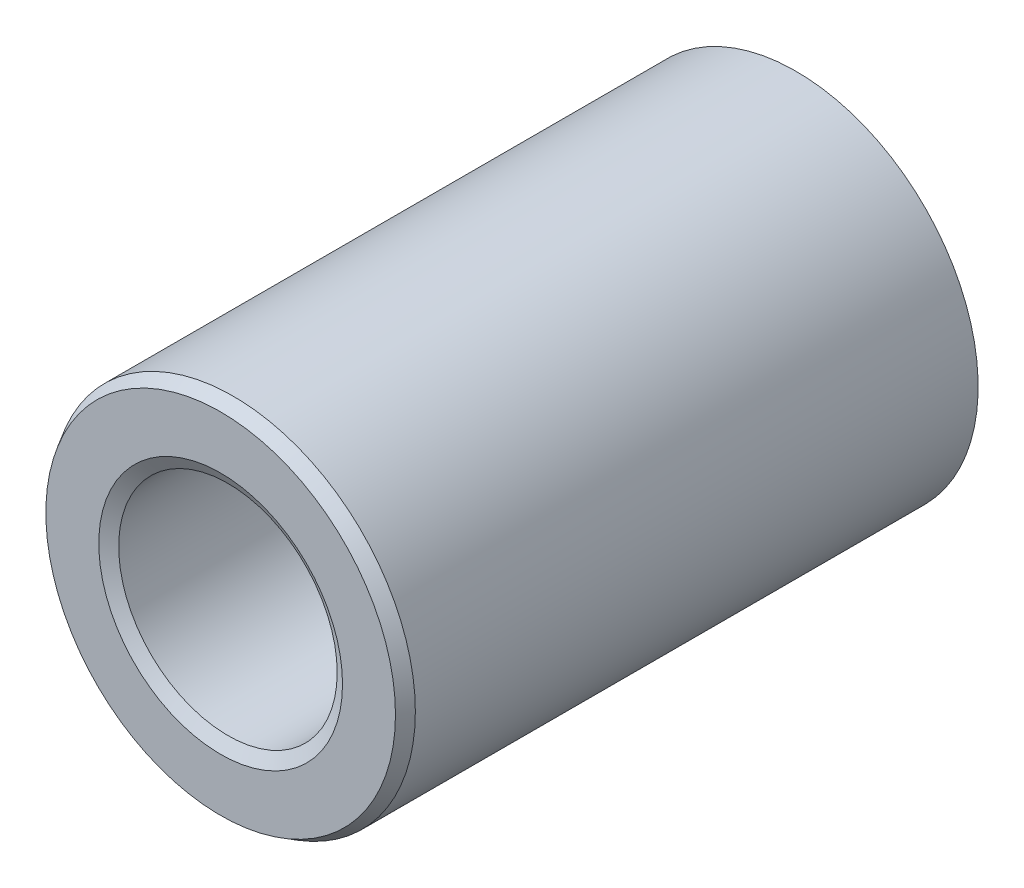
ISO-10303-21;
HEADER;
FILE_DESCRIPTION(('STEP AP214'),'2;1');
FILE_NAME('part.step','',(''),(''),'','','');
FILE_SCHEMA(('AUTOMOTIVE_DESIGN { 1 0 10303 214 1 1 1 1 }'));
ENDSEC;
DATA;
#1=APPLICATION_CONTEXT('core data for automotive mechanical design processes');
#2=APPLICATION_PROTOCOL_DEFINITION('international standard','automotive_design',2000,#1);
#3=PRODUCT_CONTEXT('',#1,'mechanical');
#4=PRODUCT('Part','Part','',(#3));
#5=PRODUCT_RELATED_PRODUCT_CATEGORY('part','',(#4));
#6=PRODUCT_DEFINITION_FORMATION('','',#4);
#7=PRODUCT_DEFINITION_CONTEXT('part definition',#1,'design');
#8=PRODUCT_DEFINITION('design','',#6,#7);
#9=PRODUCT_DEFINITION_SHAPE('','',#8);
#10=(LENGTH_UNIT() NAMED_UNIT(*) SI_UNIT(.MILLI.,.METRE.));
#11=(NAMED_UNIT(*) PLANE_ANGLE_UNIT() SI_UNIT($,.RADIAN.));
#12=(NAMED_UNIT(*) SI_UNIT($,.STERADIAN.) SOLID_ANGLE_UNIT());
#13=UNCERTAINTY_MEASURE_WITH_UNIT(LENGTH_MEASURE(1.E-05),#10,'distance_accuracy_value','');
#14=(GEOMETRIC_REPRESENTATION_CONTEXT(3) GLOBAL_UNCERTAINTY_ASSIGNED_CONTEXT((#13)) GLOBAL_UNIT_ASSIGNED_CONTEXT((#10,
#11,#12)) REPRESENTATION_CONTEXT('',''));
#15=CARTESIAN_POINT('',(0.,0.,0.));
#16=DIRECTION('',(0.,0.,1.));
#17=DIRECTION('',(1.,0.,0.));
#18=AXIS2_PLACEMENT_3D('',#15,#16,#17);
#19=CARTESIAN_POINT('',(0.,0.,-4.));
#20=DIRECTION('',(0.,0.,-1.));
#21=DIRECTION('',(1.,0.,0.));
#22=AXIS2_PLACEMENT_3D('',#19,#20,#21);
#23=PLANE('',#22);
#24=CARTESIAN_POINT('',(0.,0.,-4.));
#25=DIRECTION('',(0.,0.,1.));
#26=DIRECTION('',(1.,0.,0.));
#27=AXIS2_PLACEMENT_3D('',#24,#25,#26);
#28=CIRCLE('',#27,1.6);
#29=CARTESIAN_POINT('',(1.6,0.,-4.));
#30=VERTEX_POINT('',#29);
#31=EDGE_CURVE('E10',#30,#30,#28,.F.);
#32=ORIENTED_EDGE('',*,*,#31,.F.);
#33=EDGE_LOOP('',(#32));
#34=FACE_BOUND('',#33,.T.);
#35=CARTESIAN_POINT('',(0.,0.,-4.));
#36=DIRECTION('',(0.,0.,1.));
#37=DIRECTION('',(1.,0.,0.));
#38=AXIS2_PLACEMENT_3D('',#35,#36,#37);
#39=CIRCLE('',#38,2.32679491924311);
#40=CARTESIAN_POINT('',(-2.32679491924311,0.,-4.));
#41=VERTEX_POINT('',#40);
#42=EDGE_CURVE('E46',#41,#41,#39,.T.);
#43=ORIENTED_EDGE('',*,*,#42,.F.);
#44=EDGE_LOOP('',(#43));
#45=FACE_BOUND('',#44,.T.);
#46=ADVANCED_FACE('F39',(#34,#45),#23,.T.);
#47=CARTESIAN_POINT('',(0.,0.,4.));
#48=DIRECTION('',(0.,0.,-1.));
#49=DIRECTION('',(1.,0.,0.));
#50=AXIS2_PLACEMENT_3D('',#47,#48,#49);
#51=PLANE('',#50);
#52=CARTESIAN_POINT('',(0.,0.,4.));
#53=DIRECTION('',(0.,0.,1.));
#54=DIRECTION('',(1.,0.,0.));
#55=AXIS2_PLACEMENT_3D('',#52,#53,#54);
#56=CIRCLE('',#55,1.67320508075689);
#57=CARTESIAN_POINT('',(1.67320508075689,0.,4.));
#58=VERTEX_POINT('',#57);
#59=EDGE_CURVE('E65',#58,#58,#56,.T.);
#60=ORIENTED_EDGE('',*,*,#59,.F.);
#61=EDGE_LOOP('',(#60));
#62=FACE_BOUND('',#61,.T.);
#63=CARTESIAN_POINT('',(0.,0.,4.));
#64=DIRECTION('',(0.,0.,1.));
#65=DIRECTION('',(1.,0.,0.));
#66=AXIS2_PLACEMENT_3D('',#63,#64,#65);
#67=CIRCLE('',#66,2.4);
#68=CARTESIAN_POINT('',(2.4,0.,4.));
#69=VERTEX_POINT('',#68);
#70=EDGE_CURVE('E66',#69,#69,#67,.F.);
#71=ORIENTED_EDGE('',*,*,#70,.F.);
#72=EDGE_LOOP('',(#71));
#73=FACE_BOUND('',#72,.T.);
#74=ADVANCED_FACE('F75',(#62,#73),#51,.F.);
#75=CARTESIAN_POINT('',(0.,0.,-4.));
#76=DIRECTION('',(0.,0.,1.));
#77=DIRECTION('',(-1.,0.,0.));
#78=AXIS2_PLACEMENT_3D('',#75,#76,#77);
#79=CYLINDRICAL_SURFACE('',#78,2.5);
#80=CARTESIAN_POINT('',(0.,0.,3.82679491924311));
#81=DIRECTION('',(0.,0.,1.));
#82=DIRECTION('',(1.,0.,0.));
#83=AXIS2_PLACEMENT_3D('',#80,#81,#82);
#84=CIRCLE('',#83,2.5);
#85=CARTESIAN_POINT('',(-2.5,0.,3.82679491924311));
#86=VERTEX_POINT('',#85);
#87=EDGE_CURVE('E49',#86,#86,#84,.T.);
#88=CARTESIAN_POINT('',(0.,0.,-3.9));
#89=DIRECTION('',(0.,0.,1.));
#90=DIRECTION('',(1.,0.,0.));
#91=AXIS2_PLACEMENT_3D('',#88,#89,#90);
#92=CIRCLE('',#91,2.5);
#93=CARTESIAN_POINT('',(-2.5,0.,-3.9));
#94=VERTEX_POINT('',#93);
#95=EDGE_CURVE('E53',#94,#94,#92,.F.);
#96=CARTESIAN_POINT('',(-2.5,0.,3.82679491924311));
#97=CARTESIAN_POINT('',(-2.5,0.,3.74630747216766));
#98=CARTESIAN_POINT('',(-2.5,0.,3.66582002509221));
#99=CARTESIAN_POINT('',(-2.5,0.,3.50484513094131));
#100=CARTESIAN_POINT('',(-2.5,0.,3.42435768386586));
#101=CARTESIAN_POINT('',(-2.5,0.,3.26338278971496));
#102=CARTESIAN_POINT('',(-2.5,0.,3.18289534263951));
#103=CARTESIAN_POINT('',(-2.5,0.,3.02192044848862));
#104=CARTESIAN_POINT('',(-2.5,0.,2.94143300141317));
#105=CARTESIAN_POINT('',(-2.5,0.,2.78045810726227));
#106=CARTESIAN_POINT('',(-2.5,0.,2.69997066018682));
#107=CARTESIAN_POINT('',(-2.5,0.,2.53899576603592));
#108=CARTESIAN_POINT('',(-2.5,0.,2.45850831896047));
#109=CARTESIAN_POINT('',(-2.5,0.,2.29753342480958));
#110=CARTESIAN_POINT('',(-2.5,0.,2.21704597773413));
#111=CARTESIAN_POINT('',(-2.5,0.,2.05607108358323));
#112=CARTESIAN_POINT('',(-2.5,0.,1.97558363650778));
#113=CARTESIAN_POINT('',(-2.5,0.,1.81460874235688));
#114=CARTESIAN_POINT('',(-2.5,0.,1.73412129528143));
#115=CARTESIAN_POINT('',(-2.5,0.,1.57314640113053));
#116=CARTESIAN_POINT('',(-2.5,0.,1.49265895405508));
#117=CARTESIAN_POINT('',(-2.5,0.,1.33168405990419));
#118=CARTESIAN_POINT('',(-2.5,0.,1.25119661282874));
#119=CARTESIAN_POINT('',(-2.5,0.,1.09022171867784));
#120=CARTESIAN_POINT('',(-2.5,0.,1.00973427160239));
#121=CARTESIAN_POINT('',(-2.5,0.,0.848759377451492));
#122=CARTESIAN_POINT('',(-2.5,0.,0.768271930376043));
#123=CARTESIAN_POINT('',(-2.5,0.,0.607297036225145));
#124=CARTESIAN_POINT('',(-2.5,0.,0.526809589149696));
#125=CARTESIAN_POINT('',(-2.5,0.,0.365834694998798));
#126=CARTESIAN_POINT('',(-2.5,0.,0.285347247923349));
#127=CARTESIAN_POINT('',(-2.5,0.,0.124372353772451));
#128=CARTESIAN_POINT('',(-2.5,0.,0.043884906697002));
#129=CARTESIAN_POINT('',(-2.5,0.,-0.117089987453896));
#130=CARTESIAN_POINT('',(-2.5,0.,-0.197577434529345));
#131=CARTESIAN_POINT('',(-2.5,0.,-0.358552328680243));
#132=CARTESIAN_POINT('',(-2.5,0.,-0.439039775755692));
#133=CARTESIAN_POINT('',(-2.5,0.,-0.60001466990659));
#134=CARTESIAN_POINT('',(-2.5,0.,-0.680502116982039));
#135=CARTESIAN_POINT('',(-2.5,0.,-0.841477011132937));
#136=CARTESIAN_POINT('',(-2.5,0.,-0.921964458208386));
#137=CARTESIAN_POINT('',(-2.5,0.,-1.08293935235928));
#138=CARTESIAN_POINT('',(-2.5,0.,-1.16342679943473));
#139=CARTESIAN_POINT('',(-2.5,0.,-1.32440169358563));
#140=CARTESIAN_POINT('',(-2.5,0.,-1.40488914066108));
#141=CARTESIAN_POINT('',(-2.5,0.,-1.56586403481198));
#142=CARTESIAN_POINT('',(-2.5,0.,-1.64635148188743));
#143=CARTESIAN_POINT('',(-2.5,0.,-1.80732637603833));
#144=CARTESIAN_POINT('',(-2.5,0.,-1.88781382311377));
#145=CARTESIAN_POINT('',(-2.5,0.,-2.04878871726467));
#146=CARTESIAN_POINT('',(-2.5,0.,-2.12927616434012));
#147=CARTESIAN_POINT('',(-2.5,0.,-2.29025105849102));
#148=CARTESIAN_POINT('',(-2.5,0.,-2.37073850556647));
#149=CARTESIAN_POINT('',(-2.5,0.,-2.53171339971737));
#150=CARTESIAN_POINT('',(-2.5,0.,-2.61220084679282));
#151=CARTESIAN_POINT('',(-2.5,0.,-2.77317574094371));
#152=CARTESIAN_POINT('',(-2.5,0.,-2.85366318801916));
#153=CARTESIAN_POINT('',(-2.5,0.,-3.01463808217006));
#154=CARTESIAN_POINT('',(-2.5,0.,-3.09512552924551));
#155=CARTESIAN_POINT('',(-2.5,0.,-3.25610042339641));
#156=CARTESIAN_POINT('',(-2.5,0.,-3.33658787047186));
#157=CARTESIAN_POINT('',(-2.5,0.,-3.49756276462276));
#158=CARTESIAN_POINT('',(-2.5,0.,-3.5780502116982));
#159=CARTESIAN_POINT('',(-2.5,0.,-3.7390251058491));
#160=CARTESIAN_POINT('',(-2.5,0.,-3.81951255292455));
#161=CARTESIAN_POINT('',(-2.5,0.,-3.9));
#162=B_SPLINE_CURVE_WITH_KNOTS('',3,(#96,#97,#98,#99,#100,#101,#102,#103,#104,#105,#106,#107,
#108,#109,#110,#111,#112,#113,#114,#115,#116,#117,#118,#119,#120,#121,#122,#123,#124,#125,#126,
#127,#128,#129,#130,#131,#132,#133,#134,#135,#136,#137,#138,#139,#140,#141,#142,#143,#144,#145,
#146,#147,#148,#149,#150,#151,#152,#153,#154,#155,#156,#157,#158,#159,#160,#161),.UNSPECIFIED.,
.F.,.F.,(4,2,2,2,2,2,2,2,2,2,2,2,2,2,2,2,2,2,2,2,2,2,2,2,2,2,2,2,2,2,2,2,4),(0.,
0.241462341226347,0.482924682452694,0.724387023679041,0.965849364905388,1.20731170613174,
1.44877404735808,1.69023638858443,1.93169872981078,2.17316107103712,2.41462341226347,
2.65608575348982,2.89754809471617,3.13901043594251,3.38047277716886,3.62193511839521,
3.86339745962155,4.1048598008479,4.34632214207425,4.5877844833006,4.82924682452694,
5.07070916575329,5.31217150697964,5.55363384820598,5.79509618943233,6.03655853065868,
6.27802087188502,6.51948321311137,6.76094555433772,7.00240789556407,7.24387023679041,
7.48533257801676,7.72679491924311),.UNSPECIFIED.);
#163=EDGE_CURVE('BSEAM77',#86,#94,#162,.T.);
#164=ORIENTED_EDGE('',*,*,#87,.F.);
#165=ORIENTED_EDGE('',*,*,#95,.F.);
#166=ORIENTED_EDGE('',*,*,#163,.T.);
#167=ORIENTED_EDGE('',*,*,#163,.F.);
#168=EDGE_LOOP('',(#164,#166,#165,#167));
#169=FACE_BOUND('',#168,.T.);
#170=ADVANCED_FACE('F77',(#169),#79,.T.);
#171=CARTESIAN_POINT('',(0.,0.,-4.));
#172=DIRECTION('',(0.,0.,1.));
#173=DIRECTION('',(-1.,0.,0.));
#174=AXIS2_PLACEMENT_3D('',#171,#172,#173);
#175=CYLINDRICAL_SURFACE('',#174,1.5);
#176=CARTESIAN_POINT('',(0.,0.,3.9));
#177=DIRECTION('',(0.,0.,1.));
#178=DIRECTION('',(1.,0.,0.));
#179=AXIS2_PLACEMENT_3D('',#176,#177,#178);
#180=CIRCLE('',#179,1.5);
#181=CARTESIAN_POINT('',(1.5,0.,3.9));
#182=VERTEX_POINT('',#181);
#183=EDGE_CURVE('E56',#182,#182,#180,.F.);
#184=ORIENTED_EDGE('',*,*,#183,.F.);
#185=EDGE_LOOP('',(#184));
#186=FACE_BOUND('',#185,.T.);
#187=CARTESIAN_POINT('',(0.,0.,-3.82679491924312));
#188=DIRECTION('',(0.,0.,1.));
#189=DIRECTION('',(1.,0.,0.));
#190=AXIS2_PLACEMENT_3D('',#187,#188,#189);
#191=CIRCLE('',#190,1.5);
#192=CARTESIAN_POINT('',(1.5,0.,-3.82679491924312));
#193=VERTEX_POINT('',#192);
#194=EDGE_CURVE('E62',#193,#193,#191,.T.);
#195=ORIENTED_EDGE('',*,*,#194,.F.);
#196=EDGE_LOOP('',(#195));
#197=FACE_BOUND('',#196,.T.);
#198=ADVANCED_FACE('F84',(#186,#197),#175,.F.);
#199=CARTESIAN_POINT('',(0.,0.,4.));
#200=DIRECTION('',(0.,0.,1.));
#201=DIRECTION('',(-1.,0.,0.));
#202=AXIS2_PLACEMENT_3D('',#199,#200,#201);
#203=CONICAL_SURFACE('',#202,1.67320508075689,1.0471975511966);
#204=ORIENTED_EDGE('',*,*,#183,.T.);
#205=EDGE_LOOP('',(#204));
#206=FACE_BOUND('',#205,.T.);
#207=ORIENTED_EDGE('',*,*,#59,.T.);
#208=EDGE_LOOP('',(#207));
#209=FACE_BOUND('',#208,.T.);
#210=ADVANCED_FACE('F95',(#206,#209),#203,.F.);
#211=CARTESIAN_POINT('',(0.,0.,3.82679491924311));
#212=DIRECTION('',(0.,0.,-1.));
#213=DIRECTION('',(1.,0.,0.));
#214=AXIS2_PLACEMENT_3D('',#211,#212,#213);
#215=CONICAL_SURFACE('',#214,2.5,0.523598775598293);
#216=ORIENTED_EDGE('',*,*,#70,.T.);
#217=EDGE_LOOP('',(#216));
#218=FACE_BOUND('',#217,.T.);
#219=ORIENTED_EDGE('',*,*,#87,.T.);
#220=EDGE_LOOP('',(#219));
#221=FACE_BOUND('',#220,.T.);
#222=ADVANCED_FACE('F72',(#218,#221),#215,.T.);
#223=CARTESIAN_POINT('',(0.,0.,-3.82679491924312));
#224=DIRECTION('',(0.,0.,-1.));
#225=DIRECTION('',(1.,0.,0.));
#226=AXIS2_PLACEMENT_3D('',#223,#224,#225);
#227=CONICAL_SURFACE('',#226,1.5,0.523598775598298);
#228=ORIENTED_EDGE('',*,*,#31,.T.);
#229=EDGE_LOOP('',(#228));
#230=FACE_BOUND('',#229,.T.);
#231=ORIENTED_EDGE('',*,*,#194,.T.);
#232=EDGE_LOOP('',(#231));
#233=FACE_BOUND('',#232,.T.);
#234=ADVANCED_FACE('F100',(#230,#233),#227,.F.);
#235=CARTESIAN_POINT('',(0.,0.,-4.));
#236=DIRECTION('',(0.,0.,1.));
#237=DIRECTION('',(-1.,0.,0.));
#238=AXIS2_PLACEMENT_3D('',#235,#236,#237);
#239=CONICAL_SURFACE('',#238,2.32679491924311,1.04719755119659);
#240=CARTESIAN_POINT('',(-2.5,0.,-3.9));
#241=CARTESIAN_POINT('',(-2.49819578040878,0.,-3.90104166666667));
#242=CARTESIAN_POINT('',(-2.49639156081756,0.,-3.90208333333333));
#243=CARTESIAN_POINT('',(-2.49278312163513,0.,-3.90416666666667));
#244=CARTESIAN_POINT('',(-2.49097890204391,0.,-3.90520833333333));
#245=CARTESIAN_POINT('',(-2.48737046286148,0.,-3.90729166666667));
#246=CARTESIAN_POINT('',(-2.48556624327026,0.,-3.90833333333333));
#247=CARTESIAN_POINT('',(-2.48195780408782,0.,-3.91041666666667));
#248=CARTESIAN_POINT('',(-2.48015358449661,0.,-3.91145833333333));
#249=CARTESIAN_POINT('',(-2.47654514531417,0.,-3.91354166666667));
#250=CARTESIAN_POINT('',(-2.47474092572295,0.,-3.91458333333333));
#251=CARTESIAN_POINT('',(-2.47113248654052,0.,-3.91666666666667));
#252=CARTESIAN_POINT('',(-2.4693282669493,0.,-3.91770833333333));
#253=CARTESIAN_POINT('',(-2.46571982776687,0.,-3.91979166666667));
#254=CARTESIAN_POINT('',(-2.46391560817565,0.,-3.92083333333333));
#255=CARTESIAN_POINT('',(-2.46030716899321,0.,-3.92291666666667));
#256=CARTESIAN_POINT('',(-2.458502949402,0.,-3.92395833333333));
#257=CARTESIAN_POINT('',(-2.45489451021956,0.,-3.92604166666667));
#258=CARTESIAN_POINT('',(-2.45309029062834,0.,-3.92708333333333));
#259=CARTESIAN_POINT('',(-2.44948185144591,0.,-3.92916666666667));
#260=CARTESIAN_POINT('',(-2.44767763185469,0.,-3.93020833333333));
#261=CARTESIAN_POINT('',(-2.44406919267226,0.,-3.93229166666667));
#262=CARTESIAN_POINT('',(-2.44226497308104,0.,-3.93333333333333));
#263=CARTESIAN_POINT('',(-2.4386565338986,0.,-3.93541666666667));
#264=CARTESIAN_POINT('',(-2.43685231430739,0.,-3.93645833333333));
#265=CARTESIAN_POINT('',(-2.43324387512495,0.,-3.93854166666667));
#266=CARTESIAN_POINT('',(-2.43143965553373,0.,-3.93958333333333));
#267=CARTESIAN_POINT('',(-2.4278312163513,0.,-3.94166666666667));
#268=CARTESIAN_POINT('',(-2.42602699676008,0.,-3.94270833333333));
#269=CARTESIAN_POINT('',(-2.42241855757764,0.,-3.94479166666667));
#270=CARTESIAN_POINT('',(-2.42061433798643,0.,-3.94583333333333));
#271=CARTESIAN_POINT('',(-2.41700589880399,0.,-3.94791666666667));
#272=CARTESIAN_POINT('',(-2.41520167921277,0.,-3.94895833333333));
#273=CARTESIAN_POINT('',(-2.41159324003034,0.,-3.95104166666667));
#274=CARTESIAN_POINT('',(-2.40978902043912,0.,-3.95208333333333));
#275=CARTESIAN_POINT('',(-2.40618058125669,0.,-3.95416666666667));
#276=CARTESIAN_POINT('',(-2.40437636166547,0.,-3.95520833333333));
#277=CARTESIAN_POINT('',(-2.40076792248303,0.,-3.95729166666667));
#278=CARTESIAN_POINT('',(-2.39896370289182,0.,-3.95833333333333));
#279=CARTESIAN_POINT('',(-2.39535526370938,0.,-3.96041666666667));
#280=CARTESIAN_POINT('',(-2.39355104411816,0.,-3.96145833333333));
#281=CARTESIAN_POINT('',(-2.38994260493573,0.,-3.96354166666667));
#282=CARTESIAN_POINT('',(-2.38813838534451,0.,-3.96458333333333));
#283=CARTESIAN_POINT('',(-2.38452994616208,0.,-3.96666666666667));
#284=CARTESIAN_POINT('',(-2.38272572657086,0.,-3.96770833333333));
#285=CARTESIAN_POINT('',(-2.37911728738842,0.,-3.96979166666667));
#286=CARTESIAN_POINT('',(-2.37731306779721,0.,-3.97083333333333));
#287=CARTESIAN_POINT('',(-2.37370462861477,0.,-3.97291666666667));
#288=CARTESIAN_POINT('',(-2.37190040902355,0.,-3.97395833333333));
#289=CARTESIAN_POINT('',(-2.36829196984112,0.,-3.97604166666667));
#290=CARTESIAN_POINT('',(-2.3664877502499,0.,-3.97708333333333));
#291=CARTESIAN_POINT('',(-2.36287931106746,0.,-3.97916666666667));
#292=CARTESIAN_POINT('',(-2.36107509147625,0.,-3.98020833333333));
#293=CARTESIAN_POINT('',(-2.35746665229381,0.,-3.98229166666667));
#294=CARTESIAN_POINT('',(-2.35566243270259,0.,-3.98333333333333));
#295=CARTESIAN_POINT('',(-2.35205399352016,0.,-3.98541666666667));
#296=CARTESIAN_POINT('',(-2.35024977392894,0.,-3.98645833333333));
#297=CARTESIAN_POINT('',(-2.34664133474651,0.,-3.98854166666667));
#298=CARTESIAN_POINT('',(-2.34483711515529,0.,-3.98958333333333));
#299=CARTESIAN_POINT('',(-2.34122867597285,0.,-3.99166666666667));
#300=CARTESIAN_POINT('',(-2.33942445638164,0.,-3.99270833333333));
#301=CARTESIAN_POINT('',(-2.3358160171992,0.,-3.99479166666667));
#302=CARTESIAN_POINT('',(-2.33401179760798,0.,-3.99583333333333));
#303=CARTESIAN_POINT('',(-2.33040335842555,0.,-3.99791666666667));
#304=CARTESIAN_POINT('',(-2.32859913883433,0.,-3.99895833333333));
#305=CARTESIAN_POINT('',(-2.32679491924311,0.,-4.));
#306=B_SPLINE_CURVE_WITH_KNOTS('',3,(#240,#241,#242,#243,#244,#245,#246,#247,#248,#249,#250,
#251,#252,#253,#254,#255,#256,#257,#258,#259,#260,#261,#262,#263,#264,#265,#266,#267,#268,#269,
#270,#271,#272,#273,#274,#275,#276,#277,#278,#279,#280,#281,#282,#283,#284,#285,#286,#287,#288,
#289,#290,#291,#292,#293,#294,#295,#296,#297,#298,#299,#300,#301,#302,#303,#304,#305),
.UNSPECIFIED.,.F.,.F.,(4,2,2,2,2,2,2,2,2,2,2,2,2,2,2,2,2,2,2,2,2,2,2,2,2,2,2,2,2,2,2,2,4),(0.,
0.00624999999999992,0.0125,0.0187499999999997,0.0249999999999998,0.03125,0.0374999999999997,
0.0437500000000002,0.0499999999999999,0.0562499999999996,0.0624999999999997,0.0687499999999994,
0.0749999999999999,0.0812499999999996,0.0874999999999993,0.0937499999999995,0.0999999999999995,
0.10625,0.112499999999999,0.118749999999999,0.125,0.131249999999999,0.137499999999999,
0.143749999999999,0.149999999999999,0.156249999999999,0.162499999999999,0.168749999999999,
0.174999999999999,0.181249999999999,0.187499999999999,0.193749999999999,0.199999999999999),.UNSPECIFIED.);
#307=EDGE_CURVE('BSEAM41',#94,#41,#306,.T.);
#308=ORIENTED_EDGE('',*,*,#95,.T.);
#309=ORIENTED_EDGE('',*,*,#42,.T.);
#310=ORIENTED_EDGE('',*,*,#307,.T.);
#311=ORIENTED_EDGE('',*,*,#307,.F.);
#312=EDGE_LOOP('',(#308,#310,#309,#311));
#313=FACE_BOUND('',#312,.T.);
#314=ADVANCED_FACE('F41',(#313),#239,.T.);
#315=CLOSED_SHELL('',(#46,#74,#170,#198,#210,#222,#234,#314));
#316=MANIFOLD_SOLID_BREP('B2',#315);
#317=ADVANCED_BREP_SHAPE_REPRESENTATION('',(#18,#316),#14);
#318=SHAPE_DEFINITION_REPRESENTATION(#9,#317);
ENDSEC;
END-ISO-10303-21;
